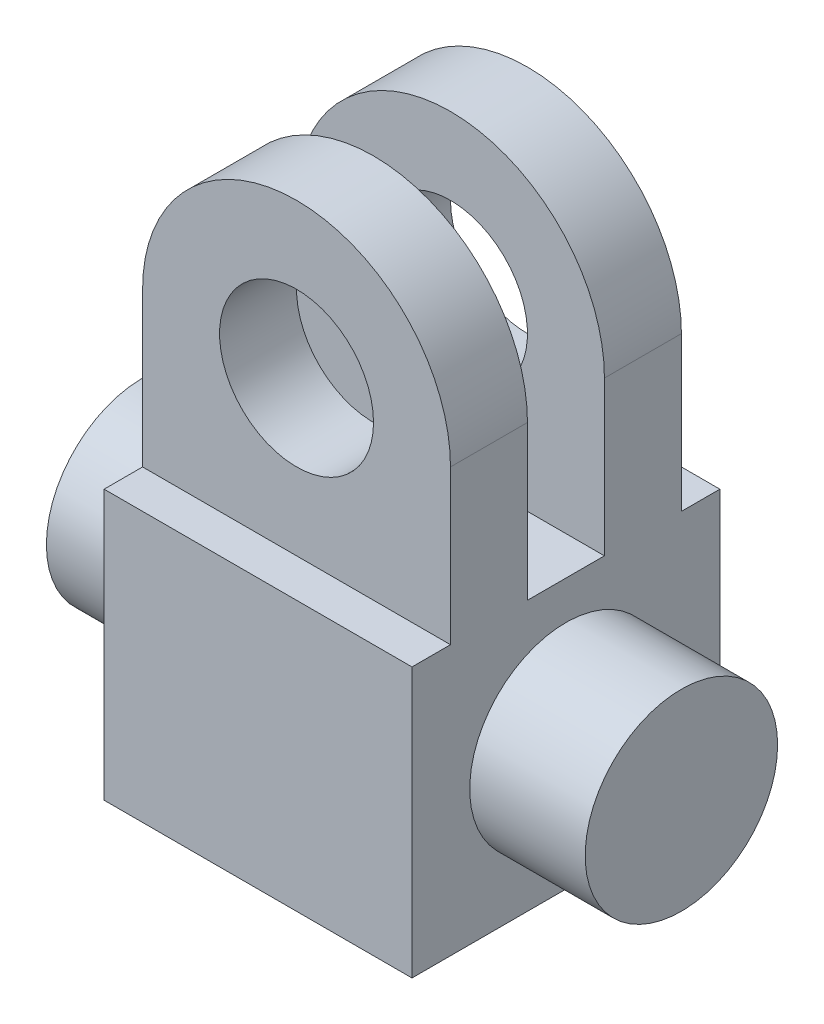
ISO-10303-21;
HEADER;
FILE_DESCRIPTION(('STEP AP214'),'2;1');
FILE_NAME('part.step','',(''),(''),'','','');
FILE_SCHEMA(('AUTOMOTIVE_DESIGN { 1 0 10303 214 1 1 1 1 }'));
ENDSEC;
DATA;
#1=APPLICATION_CONTEXT('core data for automotive mechanical design processes');
#2=APPLICATION_PROTOCOL_DEFINITION('international standard','automotive_design',2000,#1);
#3=PRODUCT_CONTEXT('',#1,'mechanical');
#4=PRODUCT('Part','Part','',(#3));
#5=PRODUCT_RELATED_PRODUCT_CATEGORY('part','',(#4));
#6=PRODUCT_DEFINITION_FORMATION('','',#4);
#7=PRODUCT_DEFINITION_CONTEXT('part definition',#1,'design');
#8=PRODUCT_DEFINITION('design','',#6,#7);
#9=PRODUCT_DEFINITION_SHAPE('','',#8);
#10=(LENGTH_UNIT() NAMED_UNIT(*) SI_UNIT(.MILLI.,.METRE.));
#11=(NAMED_UNIT(*) PLANE_ANGLE_UNIT() SI_UNIT($,.RADIAN.));
#12=(NAMED_UNIT(*) SI_UNIT($,.STERADIAN.) SOLID_ANGLE_UNIT());
#13=UNCERTAINTY_MEASURE_WITH_UNIT(LENGTH_MEASURE(1.E-05),#10,'distance_accuracy_value','');
#14=(GEOMETRIC_REPRESENTATION_CONTEXT(3) GLOBAL_UNCERTAINTY_ASSIGNED_CONTEXT((#13)) GLOBAL_UNIT_ASSIGNED_CONTEXT((#10,
#11,#12)) REPRESENTATION_CONTEXT('',''));
#15=CARTESIAN_POINT('',(0.,0.,0.));
#16=DIRECTION('',(0.,0.,1.));
#17=DIRECTION('',(1.,0.,0.));
#18=AXIS2_PLACEMENT_3D('',#15,#16,#17);
#19=CARTESIAN_POINT('',(40.,70.,-80.));
#20=DIRECTION('',(0.,1.,0.));
#21=DIRECTION('',(0.,0.,1.));
#22=AXIS2_PLACEMENT_3D('',#19,#20,#21);
#23=PLANE('',#22);
#24=DIRECTION('',(0.,0.,1.));
#25=VECTOR('',#24,1.);
#26=CARTESIAN_POINT('',(40.,70.,-80.));
#27=LINE('',#26,#25);
#28=CARTESIAN_POINT('',(40.,70.,-50.));
#29=VERTEX_POINT('',#28);
#30=CARTESIAN_POINT('',(40.,70.,-30.));
#31=VERTEX_POINT('',#30);
#32=EDGE_CURVE('E62',#29,#31,#27,.T.);
#33=ORIENTED_EDGE('',*,*,#32,.F.);
#34=DIRECTION('',(-1.,0.,0.));
#35=VECTOR('',#34,1.);
#36=CARTESIAN_POINT('',(40.,70.,-50.));
#37=LINE('',#36,#35);
#38=CARTESIAN_POINT('',(-40.,70.,-50.));
#39=VERTEX_POINT('',#38);
#40=EDGE_CURVE('E148',#29,#39,#37,.T.);
#41=ORIENTED_EDGE('',*,*,#40,.T.);
#42=DIRECTION('',(0.,0.,1.));
#43=VECTOR('',#42,1.);
#44=CARTESIAN_POINT('',(-40.,70.,-80.));
#45=LINE('',#44,#43);
#46=CARTESIAN_POINT('',(-40.,70.,-30.));
#47=VERTEX_POINT('',#46);
#48=EDGE_CURVE('E269',#39,#47,#45,.T.);
#49=ORIENTED_EDGE('',*,*,#48,.T.);
#50=DIRECTION('',(1.,0.,0.));
#51=VECTOR('',#50,1.);
#52=CARTESIAN_POINT('',(-40.,70.,-30.));
#53=LINE('',#52,#51);
#54=EDGE_CURVE('E195',#47,#31,#53,.T.);
#55=ORIENTED_EDGE('',*,*,#54,.T.);
#56=EDGE_LOOP('',(#33,#41,#49,#55));
#57=FACE_BOUND('',#56,.T.);
#58=ADVANCED_FACE('F39',(#57),#23,.T.);
#59=DIRECTION('',(-1.,0.,0.));
#60=VECTOR('',#59,1.);
#61=CARTESIAN_POINT('',(40.,70.,-70.));
#62=LINE('',#61,#60);
#63=CARTESIAN_POINT('',(40.,70.,-70.));
#64=VERTEX_POINT('',#63);
#65=CARTESIAN_POINT('',(-40.,70.,-70.));
#66=VERTEX_POINT('',#65);
#67=EDGE_CURVE('E157',#64,#66,#62,.T.);
#68=ORIENTED_EDGE('',*,*,#67,.F.);
#69=CARTESIAN_POINT('',(40.,70.,-80.));
#70=VERTEX_POINT('',#69);
#71=EDGE_CURVE('E271',#70,#64,#27,.T.);
#72=ORIENTED_EDGE('',*,*,#71,.F.);
#73=DIRECTION('',(-1.,0.,0.));
#74=VECTOR('',#73,1.);
#75=CARTESIAN_POINT('',(40.,70.,-80.));
#76=LINE('',#75,#74);
#77=CARTESIAN_POINT('',(-40.,70.,-80.));
#78=VERTEX_POINT('',#77);
#79=EDGE_CURVE('E241',#70,#78,#76,.T.);
#80=ORIENTED_EDGE('',*,*,#79,.T.);
#81=EDGE_CURVE('E266',#78,#66,#45,.T.);
#82=ORIENTED_EDGE('',*,*,#81,.T.);
#83=EDGE_LOOP('',(#68,#72,#80,#82));
#84=FACE_BOUND('',#83,.T.);
#85=ADVANCED_FACE('F298',(#84),#23,.T.);
#86=CARTESIAN_POINT('',(-40.,70.,-80.));
#87=DIRECTION('',(-1.,0.,0.));
#88=DIRECTION('',(0.,0.,1.));
#89=AXIS2_PLACEMENT_3D('',#86,#87,#88);
#90=PLANE('',#89);
#91=CARTESIAN_POINT('',(-40.,35.,-40.));
#92=DIRECTION('',(-1.,0.,0.));
#93=DIRECTION('',(0.,0.,1.));
#94=AXIS2_PLACEMENT_3D('',#91,#92,#93);
#95=CIRCLE('',#94,25.);
#96=CARTESIAN_POINT('',(-40.,35.,-15.));
#97=VERTEX_POINT('',#96);
#98=EDGE_CURVE('E11',#97,#97,#95,.T.);
#99=ORIENTED_EDGE('',*,*,#98,.F.);
#100=EDGE_LOOP('',(#99));
#101=FACE_BOUND('',#100,.T.);
#102=DIRECTION('',(0.,-1.,0.));
#103=VECTOR('',#102,1.);
#104=CARTESIAN_POINT('',(-40.,70.,0.));
#105=LINE('',#104,#103);
#106=CARTESIAN_POINT('',(-40.,70.,0.));
#107=VERTEX_POINT('',#106);
#108=CARTESIAN_POINT('',(-40.,0.,0.));
#109=VERTEX_POINT('',#108);
#110=EDGE_CURVE('E237',#107,#109,#105,.T.);
#111=ORIENTED_EDGE('',*,*,#110,.F.);
#112=CARTESIAN_POINT('',(-40.,70.,-10.));
#113=VERTEX_POINT('',#112);
#114=EDGE_CURVE('E270',#113,#107,#45,.T.);
#115=ORIENTED_EDGE('',*,*,#114,.F.);
#116=DIRECTION('',(0.,-1.,0.));
#117=VECTOR('',#116,1.);
#118=CARTESIAN_POINT('',(-40.,110.,-10.));
#119=LINE('',#118,#117);
#120=CARTESIAN_POINT('',(-40.,110.,-10.));
#121=VERTEX_POINT('',#120);
#122=EDGE_CURVE('E206',#121,#113,#119,.T.);
#123=ORIENTED_EDGE('',*,*,#122,.F.);
#124=DIRECTION('',(0.,0.,1.));
#125=VECTOR('',#124,1.);
#126=CARTESIAN_POINT('',(-40.,110.,-30.));
#127=LINE('',#126,#125);
#128=CARTESIAN_POINT('',(-40.,110.,-30.));
#129=VERTEX_POINT('',#128);
#130=EDGE_CURVE('E202',#129,#121,#127,.T.);
#131=ORIENTED_EDGE('',*,*,#130,.F.);
#132=DIRECTION('',(0.,-1.,0.));
#133=VECTOR('',#132,1.);
#134=CARTESIAN_POINT('',(-40.,110.,-30.));
#135=LINE('',#134,#133);
#136=EDGE_CURVE('E190',#129,#47,#135,.T.);
#137=ORIENTED_EDGE('',*,*,#136,.T.);
#138=ORIENTED_EDGE('',*,*,#48,.F.);
#139=DIRECTION('',(0.,1.,0.));
#140=VECTOR('',#139,1.);
#141=CARTESIAN_POINT('',(-40.,70.,-50.));
#142=LINE('',#141,#140);
#143=CARTESIAN_POINT('',(-40.,110.,-50.));
#144=VERTEX_POINT('',#143);
#145=EDGE_CURVE('E140',#39,#144,#142,.T.);
#146=ORIENTED_EDGE('',*,*,#145,.T.);
#147=DIRECTION('',(0.,0.,-1.));
#148=VECTOR('',#147,1.);
#149=CARTESIAN_POINT('',(-40.,110.,-50.));
#150=LINE('',#149,#148);
#151=CARTESIAN_POINT('',(-40.,110.,-70.));
#152=VERTEX_POINT('',#151);
#153=EDGE_CURVE('E139',#144,#152,#150,.T.);
#154=ORIENTED_EDGE('',*,*,#153,.T.);
#155=DIRECTION('',(0.,1.,0.));
#156=VECTOR('',#155,1.);
#157=CARTESIAN_POINT('',(-40.,70.,-70.));
#158=LINE('',#157,#156);
#159=EDGE_CURVE('E153',#66,#152,#158,.T.);
#160=ORIENTED_EDGE('',*,*,#159,.F.);
#161=ORIENTED_EDGE('',*,*,#81,.F.);
#162=DIRECTION('',(0.,-1.,0.));
#163=VECTOR('',#162,1.);
#164=CARTESIAN_POINT('',(-40.,70.,-80.));
#165=LINE('',#164,#163);
#166=CARTESIAN_POINT('',(-40.,0.,-80.));
#167=VERTEX_POINT('',#166);
#168=EDGE_CURVE('E245',#78,#167,#165,.T.);
#169=ORIENTED_EDGE('',*,*,#168,.T.);
#170=DIRECTION('',(0.,0.,1.));
#171=VECTOR('',#170,1.);
#172=CARTESIAN_POINT('',(-40.,0.,-80.));
#173=LINE('',#172,#171);
#174=EDGE_CURVE('E232',#167,#109,#173,.T.);
#175=ORIENTED_EDGE('',*,*,#174,.T.);
#176=EDGE_LOOP('',(#111,#115,#123,#131,#137,#138,#146,#154,#160,#161,#169,#175));
#177=FACE_BOUND('',#176,.T.);
#178=ADVANCED_FACE('F290',(#101,#177),#90,.T.);
#179=DIRECTION('',(1.,0.,0.));
#180=VECTOR('',#179,1.);
#181=CARTESIAN_POINT('',(0.,70.,-10.));
#182=LINE('',#181,#180);
#183=CARTESIAN_POINT('',(40.,70.,-10.));
#184=VERTEX_POINT('',#183);
#185=EDGE_CURVE('E209',#113,#184,#182,.T.);
#186=ORIENTED_EDGE('',*,*,#185,.F.);
#187=ORIENTED_EDGE('',*,*,#114,.T.);
#188=DIRECTION('',(-1.,0.,0.));
#189=VECTOR('',#188,1.);
#190=CARTESIAN_POINT('',(40.,70.,0.));
#191=LINE('',#190,#189);
#192=CARTESIAN_POINT('',(40.,70.,0.));
#193=VERTEX_POINT('',#192);
#194=EDGE_CURVE('E256',#193,#107,#191,.T.);
#195=ORIENTED_EDGE('',*,*,#194,.F.);
#196=EDGE_CURVE('E273',#184,#193,#27,.T.);
#197=ORIENTED_EDGE('',*,*,#196,.F.);
#198=EDGE_LOOP('',(#186,#187,#195,#197));
#199=FACE_BOUND('',#198,.T.);
#200=ADVANCED_FACE('F315',(#199),#23,.T.);
#201=CARTESIAN_POINT('',(40.,0.,-80.));
#202=DIRECTION('',(1.,0.,0.));
#203=DIRECTION('',(0.,0.,-1.));
#204=AXIS2_PLACEMENT_3D('',#201,#202,#203);
#205=PLANE('',#204);
#206=CARTESIAN_POINT('',(40.,35.,-40.));
#207=DIRECTION('',(1.,0.,0.));
#208=DIRECTION('',(0.,0.,-1.));
#209=AXIS2_PLACEMENT_3D('',#206,#207,#208);
#210=CIRCLE('',#209,25.);
#211=CARTESIAN_POINT('',(40.,35.,-65.));
#212=VERTEX_POINT('',#211);
#213=EDGE_CURVE('E49',#212,#212,#210,.T.);
#214=ORIENTED_EDGE('',*,*,#213,.F.);
#215=EDGE_LOOP('',(#214));
#216=FACE_BOUND('',#215,.T.);
#217=DIRECTION('',(0.,1.,0.));
#218=VECTOR('',#217,1.);
#219=CARTESIAN_POINT('',(40.,0.,0.));
#220=LINE('',#219,#218);
#221=CARTESIAN_POINT('',(40.,0.,0.));
#222=VERTEX_POINT('',#221);
#223=EDGE_CURVE('E252',#222,#193,#220,.T.);
#224=ORIENTED_EDGE('',*,*,#223,.F.);
#225=DIRECTION('',(0.,0.,1.));
#226=VECTOR('',#225,1.);
#227=CARTESIAN_POINT('',(40.,0.,-80.));
#228=LINE('',#227,#226);
#229=CARTESIAN_POINT('',(40.,0.,-80.));
#230=VERTEX_POINT('',#229);
#231=EDGE_CURVE('E43',#230,#222,#228,.T.);
#232=ORIENTED_EDGE('',*,*,#231,.F.);
#233=DIRECTION('',(0.,1.,0.));
#234=VECTOR('',#233,1.);
#235=CARTESIAN_POINT('',(40.,0.,-80.));
#236=LINE('',#235,#234);
#237=EDGE_CURVE('E236',#230,#70,#236,.T.);
#238=ORIENTED_EDGE('',*,*,#237,.T.);
#239=ORIENTED_EDGE('',*,*,#71,.T.);
#240=DIRECTION('',(0.,-1.,0.));
#241=VECTOR('',#240,1.);
#242=CARTESIAN_POINT('',(40.,110.,-70.));
#243=LINE('',#242,#241);
#244=CARTESIAN_POINT('',(40.,110.,-70.));
#245=VERTEX_POINT('',#244);
#246=EDGE_CURVE('E133',#245,#64,#243,.T.);
#247=ORIENTED_EDGE('',*,*,#246,.F.);
#248=DIRECTION('',(0.,0.,-1.));
#249=VECTOR('',#248,1.);
#250=CARTESIAN_POINT('',(40.,110.,-50.));
#251=LINE('',#250,#249);
#252=CARTESIAN_POINT('',(40.,110.,-50.));
#253=VERTEX_POINT('',#252);
#254=EDGE_CURVE('E129',#253,#245,#251,.T.);
#255=ORIENTED_EDGE('',*,*,#254,.F.);
#256=DIRECTION('',(0.,-1.,0.));
#257=VECTOR('',#256,1.);
#258=CARTESIAN_POINT('',(40.,110.,-50.));
#259=LINE('',#258,#257);
#260=EDGE_CURVE('E57',#253,#29,#259,.T.);
#261=ORIENTED_EDGE('',*,*,#260,.T.);
#262=ORIENTED_EDGE('',*,*,#32,.T.);
#263=DIRECTION('',(0.,1.,0.));
#264=VECTOR('',#263,1.);
#265=CARTESIAN_POINT('',(40.,110.,-30.));
#266=LINE('',#265,#264);
#267=CARTESIAN_POINT('',(40.,110.,-30.));
#268=VERTEX_POINT('',#267);
#269=EDGE_CURVE('E199',#31,#268,#266,.T.);
#270=ORIENTED_EDGE('',*,*,#269,.T.);
#271=DIRECTION('',(0.,0.,1.));
#272=VECTOR('',#271,1.);
#273=CARTESIAN_POINT('',(40.,110.,-30.));
#274=LINE('',#273,#272);
#275=CARTESIAN_POINT('',(40.,110.,-10.));
#276=VERTEX_POINT('',#275);
#277=EDGE_CURVE('E215',#268,#276,#274,.T.);
#278=ORIENTED_EDGE('',*,*,#277,.T.);
#279=DIRECTION('',(0.,1.,0.));
#280=VECTOR('',#279,1.);
#281=CARTESIAN_POINT('',(40.,110.,-10.));
#282=LINE('',#281,#280);
#283=EDGE_CURVE('E191',#184,#276,#282,.T.);
#284=ORIENTED_EDGE('',*,*,#283,.F.);
#285=ORIENTED_EDGE('',*,*,#196,.T.);
#286=EDGE_LOOP('',(#224,#232,#238,#239,#247,#255,#261,#262,#270,#278,#284,#285));
#287=FACE_BOUND('',#286,.T.);
#288=ADVANCED_FACE('F131',(#216,#287),#205,.T.);
#289=CARTESIAN_POINT('',(0.,0.,-80.));
#290=DIRECTION('',(0.,-1.,0.));
#291=DIRECTION('',(0.,0.,-1.));
#292=AXIS2_PLACEMENT_3D('',#289,#290,#291);
#293=PLANE('',#292);
#294=DIRECTION('',(1.,0.,0.));
#295=VECTOR('',#294,1.);
#296=CARTESIAN_POINT('',(0.,0.,0.));
#297=LINE('',#296,#295);
#298=EDGE_CURVE('E228',#109,#222,#297,.T.);
#299=ORIENTED_EDGE('',*,*,#298,.F.);
#300=ORIENTED_EDGE('',*,*,#174,.F.);
#301=DIRECTION('',(1.,0.,0.));
#302=VECTOR('',#301,1.);
#303=CARTESIAN_POINT('',(-40.,0.,-80.));
#304=LINE('',#303,#302);
#305=EDGE_CURVE('E233',#167,#230,#304,.T.);
#306=ORIENTED_EDGE('',*,*,#305,.T.);
#307=ORIENTED_EDGE('',*,*,#231,.T.);
#308=EDGE_LOOP('',(#299,#300,#306,#307));
#309=FACE_BOUND('',#308,.T.);
#310=ADVANCED_FACE('F41',(#309),#293,.T.);
#311=CARTESIAN_POINT('',(0.,0.,-80.));
#312=DIRECTION('',(0.,0.,1.));
#313=DIRECTION('',(1.,0.,0.));
#314=AXIS2_PLACEMENT_3D('',#311,#312,#313);
#315=PLANE('',#314);
#316=ORIENTED_EDGE('',*,*,#305,.F.);
#317=ORIENTED_EDGE('',*,*,#168,.F.);
#318=ORIENTED_EDGE('',*,*,#79,.F.);
#319=ORIENTED_EDGE('',*,*,#237,.F.);
#320=EDGE_LOOP('',(#316,#317,#318,#319));
#321=FACE_BOUND('',#320,.T.);
#322=ADVANCED_FACE('F294',(#321),#315,.F.);
#323=CARTESIAN_POINT('',(0.,0.,0.));
#324=DIRECTION('',(0.,0.,1.));
#325=DIRECTION('',(1.,0.,0.));
#326=AXIS2_PLACEMENT_3D('',#323,#324,#325);
#327=PLANE('',#326);
#328=ORIENTED_EDGE('',*,*,#110,.T.);
#329=ORIENTED_EDGE('',*,*,#298,.T.);
#330=ORIENTED_EDGE('',*,*,#223,.T.);
#331=ORIENTED_EDGE('',*,*,#194,.T.);
#332=EDGE_LOOP('',(#328,#329,#330,#331));
#333=FACE_BOUND('',#332,.T.);
#334=ADVANCED_FACE('F286',(#333),#327,.T.);
#335=CARTESIAN_POINT('',(70.,35.,-40.));
#336=DIRECTION('',(-1.,0.,0.));
#337=DIRECTION('',(0.,0.,1.));
#338=AXIS2_PLACEMENT_3D('',#335,#336,#337);
#339=CYLINDRICAL_SURFACE('',#338,25.);
#340=CARTESIAN_POINT('',(70.,35.,-40.));
#341=DIRECTION('',(1.,0.,0.));
#342=DIRECTION('',(0.,0.,-1.));
#343=AXIS2_PLACEMENT_3D('',#340,#341,#342);
#344=CIRCLE('',#343,25.);
#345=CARTESIAN_POINT('',(70.,35.,-65.));
#346=VERTEX_POINT('',#345);
#347=EDGE_CURVE('E223',#346,#346,#344,.T.);
#348=ORIENTED_EDGE('',*,*,#347,.F.);
#349=EDGE_LOOP('',(#348));
#350=FACE_BOUND('',#349,.T.);
#351=ORIENTED_EDGE('',*,*,#213,.T.);
#352=EDGE_LOOP('',(#351));
#353=FACE_BOUND('',#352,.T.);
#354=ADVANCED_FACE('F350',(#350,#353),#339,.T.);
#355=CARTESIAN_POINT('',(70.,35.,-40.));
#356=DIRECTION('',(1.,0.,0.));
#357=DIRECTION('',(0.,0.,-1.));
#358=AXIS2_PLACEMENT_3D('',#355,#356,#357);
#359=PLANE('',#358);
#360=ORIENTED_EDGE('',*,*,#347,.T.);
#361=EDGE_LOOP('',(#360));
#362=FACE_BOUND('',#361,.T.);
#363=ADVANCED_FACE('F355',(#362),#359,.T.);
#364=CARTESIAN_POINT('',(-70.,35.,-40.));
#365=DIRECTION('',(1.,0.,0.));
#366=DIRECTION('',(0.,0.,-1.));
#367=AXIS2_PLACEMENT_3D('',#364,#365,#366);
#368=CYLINDRICAL_SURFACE('',#367,25.);
#369=CARTESIAN_POINT('',(-70.,35.,-40.));
#370=DIRECTION('',(-1.,0.,0.));
#371=DIRECTION('',(0.,0.,1.));
#372=AXIS2_PLACEMENT_3D('',#369,#370,#371);
#373=CIRCLE('',#372,25.);
#374=CARTESIAN_POINT('',(-70.,35.,-15.));
#375=VERTEX_POINT('',#374);
#376=EDGE_CURVE('E218',#375,#375,#373,.T.);
#377=ORIENTED_EDGE('',*,*,#376,.F.);
#378=EDGE_LOOP('',(#377));
#379=FACE_BOUND('',#378,.T.);
#380=ORIENTED_EDGE('',*,*,#98,.T.);
#381=EDGE_LOOP('',(#380));
#382=FACE_BOUND('',#381,.T.);
#383=ADVANCED_FACE('F359',(#379,#382),#368,.T.);
#384=CARTESIAN_POINT('',(-70.,35.,-40.));
#385=DIRECTION('',(-1.,0.,0.));
#386=DIRECTION('',(0.,0.,1.));
#387=AXIS2_PLACEMENT_3D('',#384,#385,#386);
#388=PLANE('',#387);
#389=ORIENTED_EDGE('',*,*,#376,.T.);
#390=EDGE_LOOP('',(#389));
#391=FACE_BOUND('',#390,.T.);
#392=ADVANCED_FACE('F363',(#391),#388,.T.);
#393=CARTESIAN_POINT('',(0.,110.,-30.));
#394=DIRECTION('',(0.,0.,1.));
#395=DIRECTION('',(1.,0.,0.));
#396=AXIS2_PLACEMENT_3D('',#393,#394,#395);
#397=CYLINDRICAL_SURFACE('',#396,40.);
#398=CARTESIAN_POINT('',(0.,110.,-10.));
#399=DIRECTION('',(0.,0.,1.));
#400=DIRECTION('',(1.,0.,0.));
#401=AXIS2_PLACEMENT_3D('',#398,#399,#400);
#402=CIRCLE('',#401,40.);
#403=EDGE_CURVE('E182',#276,#121,#402,.T.);
#404=ORIENTED_EDGE('',*,*,#403,.F.);
#405=ORIENTED_EDGE('',*,*,#277,.F.);
#406=CARTESIAN_POINT('',(0.,110.,-30.));
#407=DIRECTION('',(0.,0.,1.));
#408=DIRECTION('',(1.,0.,0.));
#409=AXIS2_PLACEMENT_3D('',#406,#407,#408);
#410=CIRCLE('',#409,40.);
#411=EDGE_CURVE('E186',#268,#129,#410,.T.);
#412=ORIENTED_EDGE('',*,*,#411,.T.);
#413=ORIENTED_EDGE('',*,*,#130,.T.);
#414=EDGE_LOOP('',(#404,#405,#412,#413));
#415=FACE_BOUND('',#414,.T.);
#416=ADVANCED_FACE('F311',(#415),#397,.T.);
#417=CARTESIAN_POINT('',(0.,110.,-30.));
#418=DIRECTION('',(0.,0.,1.));
#419=DIRECTION('',(1.,0.,0.));
#420=AXIS2_PLACEMENT_3D('',#417,#418,#419);
#421=PLANE('',#420);
#422=CARTESIAN_POINT('',(0.,110.,-30.));
#423=DIRECTION('',(0.,0.,1.));
#424=DIRECTION('',(1.,0.,0.));
#425=AXIS2_PLACEMENT_3D('',#422,#423,#424);
#426=CIRCLE('',#425,20.);
#427=CARTESIAN_POINT('',(20.,110.,-30.));
#428=VERTEX_POINT('',#427);
#429=EDGE_CURVE('E178',#428,#428,#426,.T.);
#430=ORIENTED_EDGE('',*,*,#429,.T.);
#431=EDGE_LOOP('',(#430));
#432=FACE_BOUND('',#431,.T.);
#433=ORIENTED_EDGE('',*,*,#411,.F.);
#434=ORIENTED_EDGE('',*,*,#269,.F.);
#435=ORIENTED_EDGE('',*,*,#54,.F.);
#436=ORIENTED_EDGE('',*,*,#136,.F.);
#437=EDGE_LOOP('',(#433,#434,#435,#436));
#438=FACE_BOUND('',#437,.T.);
#439=ADVANCED_FACE('F308',(#432,#438),#421,.F.);
#440=CARTESIAN_POINT('',(0.,110.,-10.));
#441=DIRECTION('',(0.,0.,1.));
#442=DIRECTION('',(1.,0.,0.));
#443=AXIS2_PLACEMENT_3D('',#440,#441,#442);
#444=PLANE('',#443);
#445=CARTESIAN_POINT('',(0.,110.,-10.));
#446=DIRECTION('',(0.,0.,1.));
#447=DIRECTION('',(1.,0.,0.));
#448=AXIS2_PLACEMENT_3D('',#445,#446,#447);
#449=CIRCLE('',#448,20.);
#450=CARTESIAN_POINT('',(20.,110.,-10.));
#451=VERTEX_POINT('',#450);
#452=EDGE_CURVE('E176',#451,#451,#449,.T.);
#453=ORIENTED_EDGE('',*,*,#452,.F.);
#454=EDGE_LOOP('',(#453));
#455=FACE_BOUND('',#454,.T.);
#456=ORIENTED_EDGE('',*,*,#403,.T.);
#457=ORIENTED_EDGE('',*,*,#122,.T.);
#458=ORIENTED_EDGE('',*,*,#185,.T.);
#459=ORIENTED_EDGE('',*,*,#283,.T.);
#460=EDGE_LOOP('',(#456,#457,#458,#459));
#461=FACE_BOUND('',#460,.T.);
#462=ADVANCED_FACE('F316',(#455,#461),#444,.T.);
#463=CARTESIAN_POINT('',(0.,110.,-30.));
#464=DIRECTION('',(0.,0.,1.));
#465=DIRECTION('',(1.,0.,0.));
#466=AXIS2_PLACEMENT_3D('',#463,#464,#465);
#467=CYLINDRICAL_SURFACE('',#466,20.);
#468=ORIENTED_EDGE('',*,*,#429,.F.);
#469=EDGE_LOOP('',(#468));
#470=FACE_BOUND('',#469,.T.);
#471=ORIENTED_EDGE('',*,*,#452,.T.);
#472=EDGE_LOOP('',(#471));
#473=FACE_BOUND('',#472,.T.);
#474=ADVANCED_FACE('F318',(#470,#473),#467,.F.);
#475=CARTESIAN_POINT('',(0.,110.,-50.));
#476=DIRECTION('',(0.,0.,-1.));
#477=DIRECTION('',(-1.,0.,0.));
#478=AXIS2_PLACEMENT_3D('',#475,#476,#477);
#479=CYLINDRICAL_SURFACE('',#478,40.);
#480=CARTESIAN_POINT('',(0.,110.,-70.));
#481=DIRECTION('',(0.,0.,-1.));
#482=DIRECTION('',(-1.,0.,0.));
#483=AXIS2_PLACEMENT_3D('',#480,#481,#482);
#484=CIRCLE('',#483,40.);
#485=EDGE_CURVE('E167',#152,#245,#484,.T.);
#486=ORIENTED_EDGE('',*,*,#485,.F.);
#487=ORIENTED_EDGE('',*,*,#153,.F.);
#488=CARTESIAN_POINT('',(0.,110.,-50.));
#489=DIRECTION('',(0.,0.,-1.));
#490=DIRECTION('',(-1.,0.,0.));
#491=AXIS2_PLACEMENT_3D('',#488,#489,#490);
#492=CIRCLE('',#491,40.);
#493=EDGE_CURVE('E145',#144,#253,#492,.T.);
#494=ORIENTED_EDGE('',*,*,#493,.T.);
#495=ORIENTED_EDGE('',*,*,#254,.T.);
#496=EDGE_LOOP('',(#486,#487,#494,#495));
#497=FACE_BOUND('',#496,.T.);
#498=ADVANCED_FACE('F151',(#497),#479,.T.);
#499=CARTESIAN_POINT('',(0.,110.,-50.));
#500=DIRECTION('',(0.,0.,-1.));
#501=DIRECTION('',(-1.,0.,0.));
#502=AXIS2_PLACEMENT_3D('',#499,#500,#501);
#503=PLANE('',#502);
#504=CARTESIAN_POINT('',(0.,110.,-50.));
#505=DIRECTION('',(0.,0.,-1.));
#506=DIRECTION('',(-1.,0.,0.));
#507=AXIS2_PLACEMENT_3D('',#504,#505,#506);
#508=CIRCLE('',#507,20.);
#509=CARTESIAN_POINT('',(-20.,110.,-50.));
#510=VERTEX_POINT('',#509);
#511=EDGE_CURVE('E170',#510,#510,#508,.T.);
#512=ORIENTED_EDGE('',*,*,#511,.T.);
#513=EDGE_LOOP('',(#512));
#514=FACE_BOUND('',#513,.T.);
#515=ORIENTED_EDGE('',*,*,#493,.F.);
#516=ORIENTED_EDGE('',*,*,#145,.F.);
#517=ORIENTED_EDGE('',*,*,#40,.F.);
#518=ORIENTED_EDGE('',*,*,#260,.F.);
#519=EDGE_LOOP('',(#515,#516,#517,#518));
#520=FACE_BOUND('',#519,.T.);
#521=ADVANCED_FACE('F144',(#514,#520),#503,.F.);
#522=CARTESIAN_POINT('',(0.,110.,-70.));
#523=DIRECTION('',(0.,0.,-1.));
#524=DIRECTION('',(-1.,0.,0.));
#525=AXIS2_PLACEMENT_3D('',#522,#523,#524);
#526=PLANE('',#525);
#527=CARTESIAN_POINT('',(0.,110.,-70.));
#528=DIRECTION('',(0.,0.,-1.));
#529=DIRECTION('',(-1.,0.,0.));
#530=AXIS2_PLACEMENT_3D('',#527,#528,#529);
#531=CIRCLE('',#530,20.);
#532=CARTESIAN_POINT('',(-20.,110.,-70.));
#533=VERTEX_POINT('',#532);
#534=EDGE_CURVE('E160',#533,#533,#531,.T.);
#535=ORIENTED_EDGE('',*,*,#534,.F.);
#536=EDGE_LOOP('',(#535));
#537=FACE_BOUND('',#536,.T.);
#538=ORIENTED_EDGE('',*,*,#485,.T.);
#539=ORIENTED_EDGE('',*,*,#246,.T.);
#540=ORIENTED_EDGE('',*,*,#67,.T.);
#541=ORIENTED_EDGE('',*,*,#159,.T.);
#542=EDGE_LOOP('',(#538,#539,#540,#541));
#543=FACE_BOUND('',#542,.T.);
#544=ADVANCED_FACE('F301',(#537,#543),#526,.T.);
#545=CARTESIAN_POINT('',(0.,110.,-50.));
#546=DIRECTION('',(0.,0.,-1.));
#547=DIRECTION('',(-1.,0.,0.));
#548=AXIS2_PLACEMENT_3D('',#545,#546,#547);
#549=CYLINDRICAL_SURFACE('',#548,20.);
#550=ORIENTED_EDGE('',*,*,#511,.F.);
#551=EDGE_LOOP('',(#550));
#552=FACE_BOUND('',#551,.T.);
#553=ORIENTED_EDGE('',*,*,#534,.T.);
#554=EDGE_LOOP('',(#553));
#555=FACE_BOUND('',#554,.T.);
#556=ADVANCED_FACE('F436',(#552,#555),#549,.F.);
#557=CLOSED_SHELL('',(#58,#85,#178,#200,#288,#310,#322,#334,#354,#363,#383,#392,#416,#439,#462,
#474,#498,#521,#544,#556));
#558=MANIFOLD_SOLID_BREP('B2',#557);
#559=ADVANCED_BREP_SHAPE_REPRESENTATION('',(#18,#558),#14);
#560=SHAPE_DEFINITION_REPRESENTATION(#9,#559);
ENDSEC;
END-ISO-10303-21;
